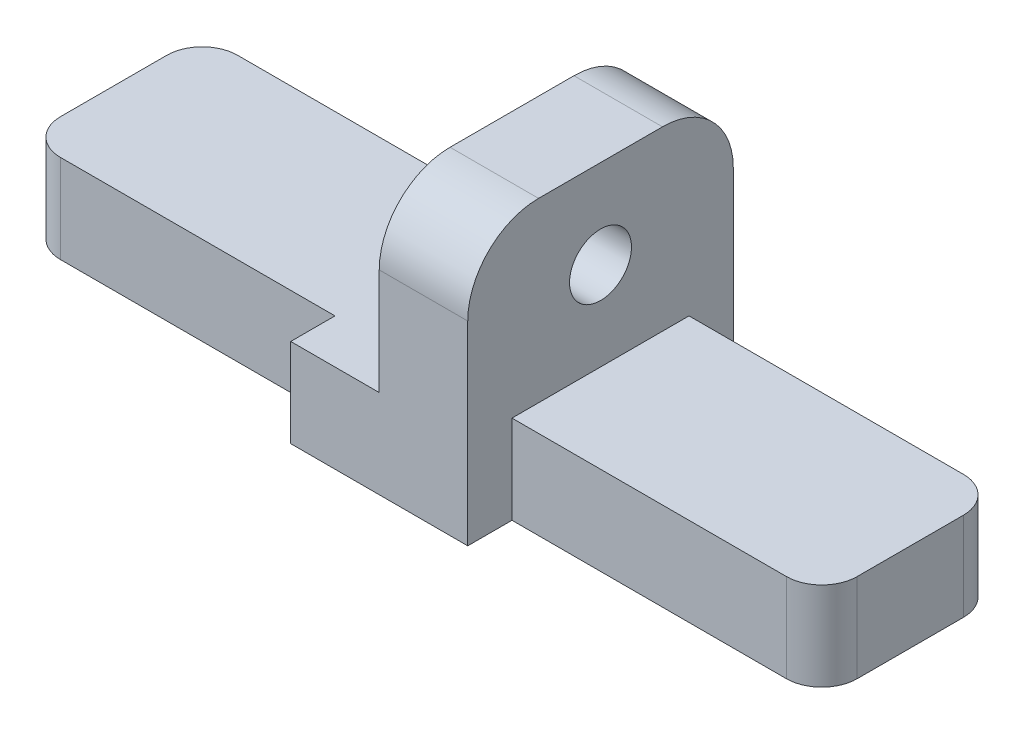
ISO-10303-21;
HEADER;
FILE_DESCRIPTION(('STEP AP214'),'2;1');
FILE_NAME('part.step','',(''),(''),'','','');
FILE_SCHEMA(('AUTOMOTIVE_DESIGN { 1 0 10303 214 1 1 1 1 }'));
ENDSEC;
DATA;
#1=APPLICATION_CONTEXT('core data for automotive mechanical design processes');
#2=APPLICATION_PROTOCOL_DEFINITION('international standard','automotive_design',2000,#1);
#3=PRODUCT_CONTEXT('',#1,'mechanical');
#4=PRODUCT('Part','Part','',(#3));
#5=PRODUCT_RELATED_PRODUCT_CATEGORY('part','',(#4));
#6=PRODUCT_DEFINITION_FORMATION('','',#4);
#7=PRODUCT_DEFINITION_CONTEXT('part definition',#1,'design');
#8=PRODUCT_DEFINITION('design','',#6,#7);
#9=PRODUCT_DEFINITION_SHAPE('','',#8);
#10=(LENGTH_UNIT() NAMED_UNIT(*) SI_UNIT(.MILLI.,.METRE.));
#11=(NAMED_UNIT(*) PLANE_ANGLE_UNIT() SI_UNIT($,.RADIAN.));
#12=(NAMED_UNIT(*) SI_UNIT($,.STERADIAN.) SOLID_ANGLE_UNIT());
#13=UNCERTAINTY_MEASURE_WITH_UNIT(LENGTH_MEASURE(1.E-05),#10,'distance_accuracy_value','');
#14=(GEOMETRIC_REPRESENTATION_CONTEXT(3) GLOBAL_UNCERTAINTY_ASSIGNED_CONTEXT((#13)) GLOBAL_UNIT_ASSIGNED_CONTEXT((#10,
#11,#12)) REPRESENTATION_CONTEXT('',''));
#15=CARTESIAN_POINT('',(0.,0.,0.));
#16=DIRECTION('',(0.,0.,1.));
#17=DIRECTION('',(1.,0.,0.));
#18=AXIS2_PLACEMENT_3D('',#15,#16,#17);
#19=CARTESIAN_POINT('',(-5.,-18.0277563773199,-7.5));
#20=DIRECTION('',(-1.,0.,0.));
#21=DIRECTION('',(0.,0.,1.));
#22=AXIS2_PLACEMENT_3D('',#19,#20,#21);
#23=PLANE('',#22);
#24=DIRECTION('',(0.,0.,1.));
#25=VECTOR('',#24,1.);
#26=CARTESIAN_POINT('',(-5.,5.,-10.));
#27=LINE('',#26,#25);
#28=CARTESIAN_POINT('',(-5.,5.,-7.5));
#29=VERTEX_POINT('',#28);
#30=CARTESIAN_POINT('',(-5.,5.,-5.));
#31=VERTEX_POINT('',#30);
#32=EDGE_CURVE('E192',#29,#31,#27,.T.);
#33=ORIENTED_EDGE('',*,*,#32,.F.);
#34=DIRECTION('',(0.,1.,0.));
#35=VECTOR('',#34,1.);
#36=CARTESIAN_POINT('',(-5.,-18.0277563773199,-7.5));
#37=LINE('',#36,#35);
#38=CARTESIAN_POINT('',(-5.,0.,-7.5));
#39=VERTEX_POINT('',#38);
#40=EDGE_CURVE('E203',#39,#29,#37,.T.);
#41=ORIENTED_EDGE('',*,*,#40,.F.);
#42=DIRECTION('',(0.,0.,-1.));
#43=VECTOR('',#42,1.);
#44=CARTESIAN_POINT('',(-5.,0.,-7.5));
#45=LINE('',#44,#43);
#46=CARTESIAN_POINT('',(-5.00000000000001,0.,-5.));
#47=VERTEX_POINT('',#46);
#48=EDGE_CURVE('E374',#47,#39,#45,.T.);
#49=ORIENTED_EDGE('',*,*,#48,.F.);
#50=DIRECTION('',(0.,-1.,0.));
#51=VECTOR('',#50,1.);
#52=CARTESIAN_POINT('',(-5.,5.,-5.));
#53=LINE('',#52,#51);
#54=EDGE_CURVE('E205',#31,#47,#53,.T.);
#55=ORIENTED_EDGE('',*,*,#54,.F.);
#56=EDGE_LOOP('',(#33,#41,#49,#55));
#57=FACE_BOUND('',#56,.T.);
#58=ADVANCED_FACE('F49',(#57),#23,.T.);
#59=CARTESIAN_POINT('',(0.,15.,0.));
#60=DIRECTION('',(0.,1.,0.));
#61=DIRECTION('',(0.,0.,1.));
#62=AXIS2_PLACEMENT_3D('',#59,#60,#61);
#63=PLANE('',#62);
#64=DIRECTION('',(-1.,0.,0.));
#65=VECTOR('',#64,1.);
#66=CARTESIAN_POINT('',(0.,15.,-3.5));
#67=LINE('',#66,#65);
#68=CARTESIAN_POINT('',(5.,15.,-3.5));
#69=VERTEX_POINT('',#68);
#70=CARTESIAN_POINT('',(0.,15.,-3.5));
#71=VERTEX_POINT('',#70);
#72=EDGE_CURVE('E331',#69,#71,#67,.T.);
#73=ORIENTED_EDGE('',*,*,#72,.T.);
#74=DIRECTION('',(0.,0.,-1.));
#75=VECTOR('',#74,1.);
#76=CARTESIAN_POINT('',(0.,15.,-10.));
#77=LINE('',#76,#75);
#78=CARTESIAN_POINT('',(0.,15.,3.5));
#79=VERTEX_POINT('',#78);
#80=EDGE_CURVE('E65',#79,#71,#77,.T.);
#81=ORIENTED_EDGE('',*,*,#80,.F.);
#82=DIRECTION('',(1.,0.,0.));
#83=VECTOR('',#82,1.);
#84=CARTESIAN_POINT('',(0.,15.,3.5));
#85=LINE('',#84,#83);
#86=CARTESIAN_POINT('',(5.,15.,3.5));
#87=VERTEX_POINT('',#86);
#88=EDGE_CURVE('E335',#79,#87,#85,.T.);
#89=ORIENTED_EDGE('',*,*,#88,.T.);
#90=DIRECTION('',(0.,0.,-1.));
#91=VECTOR('',#90,1.);
#92=CARTESIAN_POINT('',(5.,15.,-7.5));
#93=LINE('',#92,#91);
#94=EDGE_CURVE('E225',#87,#69,#93,.T.);
#95=ORIENTED_EDGE('',*,*,#94,.T.);
#96=EDGE_LOOP('',(#73,#81,#89,#95));
#97=FACE_BOUND('',#96,.T.);
#98=ADVANCED_FACE('F357',(#97),#63,.T.);
#99=CARTESIAN_POINT('',(5.,10.,0.));
#100=DIRECTION('',(-1.,0.,0.));
#101=DIRECTION('',(0.,0.,1.));
#102=AXIS2_PLACEMENT_3D('',#99,#100,#101);
#103=CYLINDRICAL_SURFACE('',#102,1.75);
#104=CARTESIAN_POINT('',(5.,10.,0.));
#105=DIRECTION('',(-1.,0.,0.));
#106=DIRECTION('',(0.,0.,1.));
#107=AXIS2_PLACEMENT_3D('',#104,#105,#106);
#108=CIRCLE('',#107,1.75);
#109=CARTESIAN_POINT('',(5.,10.,1.75));
#110=VERTEX_POINT('',#109);
#111=EDGE_CURVE('E360',#110,#110,#108,.T.);
#112=ORIENTED_EDGE('',*,*,#111,.F.);
#113=EDGE_LOOP('',(#112));
#114=FACE_BOUND('',#113,.T.);
#115=CARTESIAN_POINT('',(0.,10.,0.));
#116=DIRECTION('',(-1.,0.,0.));
#117=DIRECTION('',(0.,0.,1.));
#118=AXIS2_PLACEMENT_3D('',#115,#116,#117);
#119=CIRCLE('',#118,1.75);
#120=CARTESIAN_POINT('',(0.,10.,1.75));
#121=VERTEX_POINT('',#120);
#122=EDGE_CURVE('E424',#121,#121,#119,.F.);
#123=ORIENTED_EDGE('',*,*,#122,.F.);
#124=EDGE_LOOP('',(#123));
#125=FACE_BOUND('',#124,.T.);
#126=ADVANCED_FACE('F544',(#114,#125),#103,.F.);
#127=CARTESIAN_POINT('',(0.,11.,3.5));
#128=DIRECTION('',(1.,0.,0.));
#129=DIRECTION('',(0.,0.,-1.));
#130=AXIS2_PLACEMENT_3D('',#127,#128,#129);
#131=CYLINDRICAL_SURFACE('',#130,4.);
#132=ORIENTED_EDGE('',*,*,#88,.F.);
#133=CARTESIAN_POINT('',(0.,11.,3.5));
#134=DIRECTION('',(-1.,0.,0.));
#135=DIRECTION('',(0.,0.,1.));
#136=AXIS2_PLACEMENT_3D('',#133,#134,#135);
#137=CIRCLE('',#136,4.);
#138=CARTESIAN_POINT('',(0.,11.,7.5));
#139=VERTEX_POINT('',#138);
#140=EDGE_CURVE('E431',#79,#139,#137,.F.);
#141=ORIENTED_EDGE('',*,*,#140,.T.);
#142=DIRECTION('',(1.,0.,0.));
#143=VECTOR('',#142,1.);
#144=CARTESIAN_POINT('',(-5.,11.,7.5));
#145=LINE('',#144,#143);
#146=CARTESIAN_POINT('',(5.,11.,7.5));
#147=VERTEX_POINT('',#146);
#148=EDGE_CURVE('E343',#147,#139,#145,.F.);
#149=ORIENTED_EDGE('',*,*,#148,.F.);
#150=CARTESIAN_POINT('',(5.,11.,3.5));
#151=DIRECTION('',(1.,0.,0.));
#152=DIRECTION('',(0.,0.,-1.));
#153=AXIS2_PLACEMENT_3D('',#150,#151,#152);
#154=CIRCLE('',#153,4.);
#155=EDGE_CURVE('E73',#87,#147,#154,.T.);
#156=ORIENTED_EDGE('',*,*,#155,.F.);
#157=EDGE_LOOP('',(#132,#141,#149,#156));
#158=FACE_BOUND('',#157,.T.);
#159=ADVANCED_FACE('F647',(#158),#131,.T.);
#160=CARTESIAN_POINT('',(0.,11.,-3.5));
#161=DIRECTION('',(-1.,0.,0.));
#162=DIRECTION('',(0.,0.,1.));
#163=AXIS2_PLACEMENT_3D('',#160,#161,#162);
#164=CYLINDRICAL_SURFACE('',#163,4.);
#165=DIRECTION('',(-1.,0.,0.));
#166=VECTOR('',#165,1.);
#167=CARTESIAN_POINT('',(-5.,11.,-7.5));
#168=LINE('',#167,#166);
#169=CARTESIAN_POINT('',(0.,11.,-7.5));
#170=VERTEX_POINT('',#169);
#171=CARTESIAN_POINT('',(5.,11.,-7.5));
#172=VERTEX_POINT('',#171);
#173=EDGE_CURVE('E347',#170,#172,#168,.F.);
#174=ORIENTED_EDGE('',*,*,#173,.F.);
#175=CARTESIAN_POINT('',(0.,11.,-3.5));
#176=DIRECTION('',(-1.,0.,0.));
#177=DIRECTION('',(0.,0.,1.));
#178=AXIS2_PLACEMENT_3D('',#175,#176,#177);
#179=CIRCLE('',#178,4.);
#180=EDGE_CURVE('E58',#170,#71,#179,.F.);
#181=ORIENTED_EDGE('',*,*,#180,.T.);
#182=ORIENTED_EDGE('',*,*,#72,.F.);
#183=CARTESIAN_POINT('',(5.,11.,-3.5));
#184=DIRECTION('',(1.,0.,0.));
#185=DIRECTION('',(0.,0.,-1.));
#186=AXIS2_PLACEMENT_3D('',#183,#184,#185);
#187=CIRCLE('',#186,4.);
#188=EDGE_CURVE('E338',#172,#69,#187,.T.);
#189=ORIENTED_EDGE('',*,*,#188,.F.);
#190=EDGE_LOOP('',(#174,#181,#182,#189));
#191=FACE_BOUND('',#190,.T.);
#192=ADVANCED_FACE('F51',(#191),#164,.T.);
#193=CARTESIAN_POINT('',(-22.5,5.,-5.));
#194=DIRECTION('',(0.,0.,1.));
#195=DIRECTION('',(1.,0.,0.));
#196=AXIS2_PLACEMENT_3D('',#193,#194,#195);
#197=PLANE('',#196);
#198=DIRECTION('',(-1.,0.,0.));
#199=VECTOR('',#198,1.);
#200=CARTESIAN_POINT('',(-22.5,5.,-5.));
#201=LINE('',#200,#199);
#202=CARTESIAN_POINT('',(20.5,5.,-5.));
#203=VERTEX_POINT('',#202);
#204=CARTESIAN_POINT('',(4.99999999999999,5.,-5.));
#205=VERTEX_POINT('',#204);
#206=EDGE_CURVE('E255',#203,#205,#201,.T.);
#207=ORIENTED_EDGE('',*,*,#206,.F.);
#208=DIRECTION('',(0.,-1.,0.));
#209=VECTOR('',#208,1.);
#210=CARTESIAN_POINT('',(20.5,5.,-5.));
#211=LINE('',#210,#209);
#212=CARTESIAN_POINT('',(20.5,0.,-5.));
#213=VERTEX_POINT('',#212);
#214=EDGE_CURVE('E311',#203,#213,#211,.T.);
#215=ORIENTED_EDGE('',*,*,#214,.T.);
#216=DIRECTION('',(-1.,0.,0.));
#217=VECTOR('',#216,1.);
#218=CARTESIAN_POINT('',(-22.5,0.,-5.));
#219=LINE('',#218,#217);
#220=CARTESIAN_POINT('',(4.99999999999999,0.,-5.));
#221=VERTEX_POINT('',#220);
#222=EDGE_CURVE('E270',#213,#221,#219,.T.);
#223=ORIENTED_EDGE('',*,*,#222,.T.);
#224=DIRECTION('',(0.,1.,0.));
#225=VECTOR('',#224,1.);
#226=CARTESIAN_POINT('',(5.,5.,-5.));
#227=LINE('',#226,#225);
#228=EDGE_CURVE('E244',#221,#205,#227,.T.);
#229=ORIENTED_EDGE('',*,*,#228,.T.);
#230=EDGE_LOOP('',(#207,#215,#223,#229));
#231=FACE_BOUND('',#230,.T.);
#232=ADVANCED_FACE('F505',(#231),#197,.F.);
#233=CARTESIAN_POINT('',(-22.5,5.,5.));
#234=DIRECTION('',(0.,0.,-1.));
#235=DIRECTION('',(-1.,0.,0.));
#236=AXIS2_PLACEMENT_3D('',#233,#234,#235);
#237=PLANE('',#236);
#238=DIRECTION('',(1.,0.,0.));
#239=VECTOR('',#238,1.);
#240=CARTESIAN_POINT('',(-22.5,0.,5.));
#241=LINE('',#240,#239);
#242=CARTESIAN_POINT('',(4.99999999999999,0.,5.));
#243=VERTEX_POINT('',#242);
#244=CARTESIAN_POINT('',(20.5,0.,5.));
#245=VERTEX_POINT('',#244);
#246=EDGE_CURVE('E277',#243,#245,#241,.T.);
#247=ORIENTED_EDGE('',*,*,#246,.T.);
#248=DIRECTION('',(0.,-1.,0.));
#249=VECTOR('',#248,1.);
#250=CARTESIAN_POINT('',(20.5,5.,5.));
#251=LINE('',#250,#249);
#252=CARTESIAN_POINT('',(20.5,5.,5.));
#253=VERTEX_POINT('',#252);
#254=EDGE_CURVE('E328',#245,#253,#251,.F.);
#255=ORIENTED_EDGE('',*,*,#254,.T.);
#256=DIRECTION('',(1.,0.,0.));
#257=VECTOR('',#256,1.);
#258=CARTESIAN_POINT('',(-22.5,5.,5.));
#259=LINE('',#258,#257);
#260=CARTESIAN_POINT('',(4.99999999999999,5.,5.));
#261=VERTEX_POINT('',#260);
#262=EDGE_CURVE('E261',#261,#253,#259,.T.);
#263=ORIENTED_EDGE('',*,*,#262,.F.);
#264=DIRECTION('',(0.,-1.,0.));
#265=VECTOR('',#264,1.);
#266=CARTESIAN_POINT('',(5.,5.,5.));
#267=LINE('',#266,#265);
#268=EDGE_CURVE('E241',#261,#243,#267,.T.);
#269=ORIENTED_EDGE('',*,*,#268,.T.);
#270=EDGE_LOOP('',(#247,#255,#263,#269));
#271=FACE_BOUND('',#270,.T.);
#272=ADVANCED_FACE('F483',(#271),#237,.F.);
#273=CARTESIAN_POINT('',(0.,5.,0.));
#274=DIRECTION('',(0.,1.,0.));
#275=DIRECTION('',(0.,0.,1.));
#276=AXIS2_PLACEMENT_3D('',#273,#274,#275);
#277=PLANE('',#276);
#278=DIRECTION('',(0.,0.,-1.));
#279=VECTOR('',#278,1.);
#280=CARTESIAN_POINT('',(22.5,5.,-5.));
#281=LINE('',#280,#279);
#282=CARTESIAN_POINT('',(22.5,5.,3.));
#283=VERTEX_POINT('',#282);
#284=CARTESIAN_POINT('',(22.5,5.,-3.));
#285=VERTEX_POINT('',#284);
#286=EDGE_CURVE('E249',#283,#285,#281,.T.);
#287=ORIENTED_EDGE('',*,*,#286,.T.);
#288=CARTESIAN_POINT('',(20.5,5.,-3.));
#289=DIRECTION('',(0.,1.,0.));
#290=DIRECTION('',(0.,0.,1.));
#291=AXIS2_PLACEMENT_3D('',#288,#289,#290);
#292=CIRCLE('',#291,2.);
#293=EDGE_CURVE('E325',#285,#203,#292,.T.);
#294=ORIENTED_EDGE('',*,*,#293,.T.);
#295=ORIENTED_EDGE('',*,*,#206,.T.);
#296=DIRECTION('',(0.,0.,-1.));
#297=VECTOR('',#296,1.);
#298=CARTESIAN_POINT('',(5.,5.,0.));
#299=LINE('',#298,#297);
#300=EDGE_CURVE('E237',#261,#205,#299,.T.);
#301=ORIENTED_EDGE('',*,*,#300,.F.);
#302=ORIENTED_EDGE('',*,*,#262,.T.);
#303=CARTESIAN_POINT('',(20.5,5.,3.));
#304=DIRECTION('',(0.,1.,0.));
#305=DIRECTION('',(0.,0.,1.));
#306=AXIS2_PLACEMENT_3D('',#303,#304,#305);
#307=CIRCLE('',#306,2.);
#308=EDGE_CURVE('E322',#253,#283,#307,.T.);
#309=ORIENTED_EDGE('',*,*,#308,.T.);
#310=EDGE_LOOP('',(#287,#294,#295,#301,#302,#309));
#311=FACE_BOUND('',#310,.T.);
#312=ADVANCED_FACE('F494',(#311),#277,.T.);
#313=CARTESIAN_POINT('',(22.5,5.,-5.));
#314=DIRECTION('',(-1.,0.,0.));
#315=DIRECTION('',(0.,0.,1.));
#316=AXIS2_PLACEMENT_3D('',#313,#314,#315);
#317=PLANE('',#316);
#318=DIRECTION('',(0.,0.,-1.));
#319=VECTOR('',#318,1.);
#320=CARTESIAN_POINT('',(22.5,0.,-5.));
#321=LINE('',#320,#319);
#322=CARTESIAN_POINT('',(22.5,0.,3.));
#323=VERTEX_POINT('',#322);
#324=CARTESIAN_POINT('',(22.5,0.,-3.));
#325=VERTEX_POINT('',#324);
#326=EDGE_CURVE('E248',#323,#325,#321,.T.);
#327=ORIENTED_EDGE('',*,*,#326,.T.);
#328=DIRECTION('',(0.,-1.,0.));
#329=VECTOR('',#328,1.);
#330=CARTESIAN_POINT('',(22.5,5.,-3.));
#331=LINE('',#330,#329);
#332=EDGE_CURVE('E319',#325,#285,#331,.F.);
#333=ORIENTED_EDGE('',*,*,#332,.T.);
#334=ORIENTED_EDGE('',*,*,#286,.F.);
#335=DIRECTION('',(0.,-1.,0.));
#336=VECTOR('',#335,1.);
#337=CARTESIAN_POINT('',(22.5,5.,3.));
#338=LINE('',#337,#336);
#339=EDGE_CURVE('E315',#283,#323,#338,.T.);
#340=ORIENTED_EDGE('',*,*,#339,.T.);
#341=EDGE_LOOP('',(#327,#333,#334,#340));
#342=FACE_BOUND('',#341,.T.);
#343=ADVANCED_FACE('F497',(#342),#317,.F.);
#344=CARTESIAN_POINT('',(-20.5,0.,-5.));
#345=VERTEX_POINT('',#344);
#346=EDGE_CURVE('E269',#47,#345,#219,.T.);
#347=ORIENTED_EDGE('',*,*,#346,.T.);
#348=DIRECTION('',(0.,-1.,0.));
#349=VECTOR('',#348,1.);
#350=CARTESIAN_POINT('',(-20.5,5.,-5.));
#351=LINE('',#350,#349);
#352=CARTESIAN_POINT('',(-20.5,5.,-5.));
#353=VERTEX_POINT('',#352);
#354=EDGE_CURVE('E308',#345,#353,#351,.F.);
#355=ORIENTED_EDGE('',*,*,#354,.T.);
#356=EDGE_CURVE('E253',#31,#353,#201,.T.);
#357=ORIENTED_EDGE('',*,*,#356,.F.);
#358=ORIENTED_EDGE('',*,*,#54,.T.);
#359=EDGE_LOOP('',(#347,#355,#357,#358));
#360=FACE_BOUND('',#359,.T.);
#361=ADVANCED_FACE('F531',(#360),#197,.F.);
#362=CARTESIAN_POINT('',(-22.5,5.,-5.));
#363=DIRECTION('',(1.,0.,0.));
#364=DIRECTION('',(0.,0.,-1.));
#365=AXIS2_PLACEMENT_3D('',#362,#363,#364);
#366=PLANE('',#365);
#367=DIRECTION('',(0.,0.,1.));
#368=VECTOR('',#367,1.);
#369=CARTESIAN_POINT('',(-22.5,0.,-5.));
#370=LINE('',#369,#368);
#371=CARTESIAN_POINT('',(-22.5,0.,-3.));
#372=VERTEX_POINT('',#371);
#373=CARTESIAN_POINT('',(-22.5,0.,3.));
#374=VERTEX_POINT('',#373);
#375=EDGE_CURVE('E273',#372,#374,#370,.T.);
#376=ORIENTED_EDGE('',*,*,#375,.T.);
#377=DIRECTION('',(0.,-1.,0.));
#378=VECTOR('',#377,1.);
#379=CARTESIAN_POINT('',(-22.5,5.,3.));
#380=LINE('',#379,#378);
#381=CARTESIAN_POINT('',(-22.5,5.,3.));
#382=VERTEX_POINT('',#381);
#383=EDGE_CURVE('E299',#374,#382,#380,.F.);
#384=ORIENTED_EDGE('',*,*,#383,.T.);
#385=DIRECTION('',(0.,0.,1.));
#386=VECTOR('',#385,1.);
#387=CARTESIAN_POINT('',(-22.5,5.,-5.));
#388=LINE('',#387,#386);
#389=CARTESIAN_POINT('',(-22.5,5.,-3.));
#390=VERTEX_POINT('',#389);
#391=EDGE_CURVE('E258',#390,#382,#388,.T.);
#392=ORIENTED_EDGE('',*,*,#391,.F.);
#393=DIRECTION('',(0.,-1.,0.));
#394=VECTOR('',#393,1.);
#395=CARTESIAN_POINT('',(-22.5,5.,-3.));
#396=LINE('',#395,#394);
#397=EDGE_CURVE('E295',#390,#372,#396,.T.);
#398=ORIENTED_EDGE('',*,*,#397,.T.);
#399=EDGE_LOOP('',(#376,#384,#392,#398));
#400=FACE_BOUND('',#399,.T.);
#401=ADVANCED_FACE('F526',(#400),#366,.F.);
#402=CARTESIAN_POINT('',(-20.5,5.,5.));
#403=VERTEX_POINT('',#402);
#404=CARTESIAN_POINT('',(-5.,5.,5.));
#405=VERTEX_POINT('',#404);
#406=EDGE_CURVE('E262',#403,#405,#259,.T.);
#407=ORIENTED_EDGE('',*,*,#406,.F.);
#408=DIRECTION('',(0.,-1.,0.));
#409=VECTOR('',#408,1.);
#410=CARTESIAN_POINT('',(-20.5,5.,5.));
#411=LINE('',#410,#409);
#412=CARTESIAN_POINT('',(-20.5,0.,5.));
#413=VERTEX_POINT('',#412);
#414=EDGE_CURVE('E266',#403,#413,#411,.T.);
#415=ORIENTED_EDGE('',*,*,#414,.T.);
#416=CARTESIAN_POINT('',(-5.00000000000001,0.,5.));
#417=VERTEX_POINT('',#416);
#418=EDGE_CURVE('E254',#413,#417,#241,.T.);
#419=ORIENTED_EDGE('',*,*,#418,.T.);
#420=DIRECTION('',(0.,1.,0.));
#421=VECTOR('',#420,1.);
#422=CARTESIAN_POINT('',(-5.,5.,5.));
#423=LINE('',#422,#421);
#424=EDGE_CURVE('E231',#417,#405,#423,.T.);
#425=ORIENTED_EDGE('',*,*,#424,.T.);
#426=EDGE_LOOP('',(#407,#415,#419,#425));
#427=FACE_BOUND('',#426,.T.);
#428=ADVANCED_FACE('F518',(#427),#237,.F.);
#429=ORIENTED_EDGE('',*,*,#391,.T.);
#430=CARTESIAN_POINT('',(-20.5,5.,3.));
#431=DIRECTION('',(0.,1.,0.));
#432=DIRECTION('',(0.,0.,1.));
#433=AXIS2_PLACEMENT_3D('',#430,#431,#432);
#434=CIRCLE('',#433,2.);
#435=EDGE_CURVE('E305',#382,#403,#434,.T.);
#436=ORIENTED_EDGE('',*,*,#435,.T.);
#437=ORIENTED_EDGE('',*,*,#406,.T.);
#438=CARTESIAN_POINT('',(-5.,5.,7.5));
#439=VERTEX_POINT('',#438);
#440=EDGE_CURVE('E207',#405,#439,#27,.T.);
#441=ORIENTED_EDGE('',*,*,#440,.T.);
#442=DIRECTION('',(1.,0.,0.));
#443=VECTOR('',#442,1.);
#444=CARTESIAN_POINT('',(-5.,5.,7.5));
#445=LINE('',#444,#443);
#446=CARTESIAN_POINT('',(0.,5.,7.5));
#447=VERTEX_POINT('',#446);
#448=EDGE_CURVE('E365',#439,#447,#445,.T.);
#449=ORIENTED_EDGE('',*,*,#448,.T.);
#450=DIRECTION('',(0.,0.,1.));
#451=VECTOR('',#450,1.);
#452=CARTESIAN_POINT('',(0.,5.,-10.));
#453=LINE('',#452,#451);
#454=CARTESIAN_POINT('',(0.,5.,-7.5));
#455=VERTEX_POINT('',#454);
#456=EDGE_CURVE('E195',#455,#447,#453,.T.);
#457=ORIENTED_EDGE('',*,*,#456,.F.);
#458=DIRECTION('',(-1.,0.,0.));
#459=VECTOR('',#458,1.);
#460=CARTESIAN_POINT('',(-5.,5.,-7.5));
#461=LINE('',#460,#459);
#462=EDGE_CURVE('E11',#455,#29,#461,.T.);
#463=ORIENTED_EDGE('',*,*,#462,.T.);
#464=ORIENTED_EDGE('',*,*,#32,.T.);
#465=ORIENTED_EDGE('',*,*,#356,.T.);
#466=CARTESIAN_POINT('',(-20.5,5.,-3.));
#467=DIRECTION('',(0.,1.,0.));
#468=DIRECTION('',(0.,0.,1.));
#469=AXIS2_PLACEMENT_3D('',#466,#467,#468);
#470=CIRCLE('',#469,2.);
#471=EDGE_CURVE('E302',#353,#390,#470,.T.);
#472=ORIENTED_EDGE('',*,*,#471,.T.);
#473=EDGE_LOOP('',(#429,#436,#437,#441,#449,#457,#463,#464,#465,#472));
#474=FACE_BOUND('',#473,.T.);
#475=ADVANCED_FACE('F190',(#474),#277,.T.);
#476=CARTESIAN_POINT('',(0.,0.,0.));
#477=DIRECTION('',(0.,1.,0.));
#478=DIRECTION('',(0.,0.,1.));
#479=AXIS2_PLACEMENT_3D('',#476,#477,#478);
#480=PLANE('',#479);
#481=ORIENTED_EDGE('',*,*,#418,.F.);
#482=CARTESIAN_POINT('',(-20.5,0.,3.));
#483=DIRECTION('',(0.,1.,0.));
#484=DIRECTION('',(0.,0.,1.));
#485=AXIS2_PLACEMENT_3D('',#482,#483,#484);
#486=CIRCLE('',#485,2.);
#487=EDGE_CURVE('E292',#413,#374,#486,.F.);
#488=ORIENTED_EDGE('',*,*,#487,.T.);
#489=ORIENTED_EDGE('',*,*,#375,.F.);
#490=CARTESIAN_POINT('',(-20.5,0.,-3.));
#491=DIRECTION('',(0.,1.,0.));
#492=DIRECTION('',(0.,0.,1.));
#493=AXIS2_PLACEMENT_3D('',#490,#491,#492);
#494=CIRCLE('',#493,2.);
#495=EDGE_CURVE('E289',#372,#345,#494,.F.);
#496=ORIENTED_EDGE('',*,*,#495,.T.);
#497=ORIENTED_EDGE('',*,*,#346,.F.);
#498=ORIENTED_EDGE('',*,*,#48,.T.);
#499=DIRECTION('',(1.,0.,0.));
#500=VECTOR('',#499,1.);
#501=CARTESIAN_POINT('',(-5.,0.,-7.5));
#502=LINE('',#501,#500);
#503=CARTESIAN_POINT('',(5.,0.,-7.5));
#504=VERTEX_POINT('',#503);
#505=EDGE_CURVE('E211',#39,#504,#502,.T.);
#506=ORIENTED_EDGE('',*,*,#505,.T.);
#507=DIRECTION('',(0.,0.,1.));
#508=VECTOR('',#507,1.);
#509=CARTESIAN_POINT('',(5.,0.,-7.5));
#510=LINE('',#509,#508);
#511=EDGE_CURVE('E232',#504,#221,#510,.T.);
#512=ORIENTED_EDGE('',*,*,#511,.T.);
#513=ORIENTED_EDGE('',*,*,#222,.F.);
#514=CARTESIAN_POINT('',(20.5,0.,-3.));
#515=DIRECTION('',(0.,1.,0.));
#516=DIRECTION('',(0.,0.,1.));
#517=AXIS2_PLACEMENT_3D('',#514,#515,#516);
#518=CIRCLE('',#517,2.);
#519=EDGE_CURVE('E286',#213,#325,#518,.F.);
#520=ORIENTED_EDGE('',*,*,#519,.T.);
#521=ORIENTED_EDGE('',*,*,#326,.F.);
#522=CARTESIAN_POINT('',(20.5,0.,3.));
#523=DIRECTION('',(0.,1.,0.));
#524=DIRECTION('',(0.,0.,1.));
#525=AXIS2_PLACEMENT_3D('',#522,#523,#524);
#526=CIRCLE('',#525,2.);
#527=EDGE_CURVE('E283',#323,#245,#526,.F.);
#528=ORIENTED_EDGE('',*,*,#527,.T.);
#529=ORIENTED_EDGE('',*,*,#246,.F.);
#530=CARTESIAN_POINT('',(5.,0.,7.5));
#531=VERTEX_POINT('',#530);
#532=EDGE_CURVE('E377',#243,#531,#510,.T.);
#533=ORIENTED_EDGE('',*,*,#532,.T.);
#534=DIRECTION('',(-1.,0.,0.));
#535=VECTOR('',#534,1.);
#536=CARTESIAN_POINT('',(-5.,0.,7.5));
#537=LINE('',#536,#535);
#538=CARTESIAN_POINT('',(-5.,0.,7.5));
#539=VERTEX_POINT('',#538);
#540=EDGE_CURVE('E373',#531,#539,#537,.T.);
#541=ORIENTED_EDGE('',*,*,#540,.T.);
#542=EDGE_CURVE('E369',#539,#417,#45,.T.);
#543=ORIENTED_EDGE('',*,*,#542,.T.);
#544=EDGE_LOOP('',(#481,#488,#489,#496,#497,#498,#506,#512,#513,#520,#521,#528,#529,#533,#541,#543));
#545=FACE_BOUND('',#544,.T.);
#546=ADVANCED_FACE('F392',(#545),#480,.F.);
#547=CARTESIAN_POINT('',(5.,-18.0277563773199,-7.5));
#548=DIRECTION('',(1.,0.,0.));
#549=DIRECTION('',(0.,0.,-1.));
#550=AXIS2_PLACEMENT_3D('',#547,#548,#549);
#551=PLANE('',#550);
#552=ORIENTED_EDGE('',*,*,#111,.T.);
#553=EDGE_LOOP('',(#552));
#554=FACE_BOUND('',#553,.T.);
#555=ORIENTED_EDGE('',*,*,#94,.F.);
#556=ORIENTED_EDGE('',*,*,#155,.T.);
#557=DIRECTION('',(0.,1.,0.));
#558=VECTOR('',#557,1.);
#559=CARTESIAN_POINT('',(5.,-18.0277563773199,7.5));
#560=LINE('',#559,#558);
#561=EDGE_CURVE('E221',#531,#147,#560,.T.);
#562=ORIENTED_EDGE('',*,*,#561,.F.);
#563=ORIENTED_EDGE('',*,*,#532,.F.);
#564=ORIENTED_EDGE('',*,*,#268,.F.);
#565=ORIENTED_EDGE('',*,*,#300,.T.);
#566=ORIENTED_EDGE('',*,*,#228,.F.);
#567=ORIENTED_EDGE('',*,*,#511,.F.);
#568=DIRECTION('',(0.,1.,0.));
#569=VECTOR('',#568,1.);
#570=CARTESIAN_POINT('',(5.,-18.0277563773199,-7.5));
#571=LINE('',#570,#569);
#572=EDGE_CURVE('E214',#504,#172,#571,.T.);
#573=ORIENTED_EDGE('',*,*,#572,.T.);
#574=ORIENTED_EDGE('',*,*,#188,.T.);
#575=EDGE_LOOP('',(#555,#556,#562,#563,#564,#565,#566,#567,#573,#574));
#576=FACE_BOUND('',#575,.T.);
#577=ADVANCED_FACE('F508',(#554,#576),#551,.T.);
#578=ORIENTED_EDGE('',*,*,#440,.F.);
#579=ORIENTED_EDGE('',*,*,#424,.F.);
#580=ORIENTED_EDGE('',*,*,#542,.F.);
#581=DIRECTION('',(0.,1.,0.));
#582=VECTOR('',#581,1.);
#583=CARTESIAN_POINT('',(-5.,-18.0277563773199,7.5));
#584=LINE('',#583,#582);
#585=EDGE_CURVE('E213',#539,#439,#584,.T.);
#586=ORIENTED_EDGE('',*,*,#585,.T.);
#587=EDGE_LOOP('',(#578,#579,#580,#586));
#588=FACE_BOUND('',#587,.T.);
#589=ADVANCED_FACE('F514',(#588),#23,.T.);
#590=CARTESIAN_POINT('',(-5.,-18.0277563773199,7.5));
#591=DIRECTION('',(0.,0.,1.));
#592=DIRECTION('',(1.,0.,0.));
#593=AXIS2_PLACEMENT_3D('',#590,#591,#592);
#594=PLANE('',#593);
#595=ORIENTED_EDGE('',*,*,#448,.F.);
#596=ORIENTED_EDGE('',*,*,#585,.F.);
#597=ORIENTED_EDGE('',*,*,#540,.F.);
#598=ORIENTED_EDGE('',*,*,#561,.T.);
#599=ORIENTED_EDGE('',*,*,#148,.T.);
#600=DIRECTION('',(0.,-1.,0.));
#601=VECTOR('',#600,1.);
#602=CARTESIAN_POINT('',(0.,-18.0277563773199,7.5));
#603=LINE('',#602,#601);
#604=EDGE_CURVE('E427',#139,#447,#603,.T.);
#605=ORIENTED_EDGE('',*,*,#604,.T.);
#606=EDGE_LOOP('',(#595,#596,#597,#598,#599,#605));
#607=FACE_BOUND('',#606,.T.);
#608=ADVANCED_FACE('F512',(#607),#594,.T.);
#609=CARTESIAN_POINT('',(-5.,-18.0277563773199,-7.5));
#610=DIRECTION('',(0.,0.,-1.));
#611=DIRECTION('',(-1.,0.,0.));
#612=AXIS2_PLACEMENT_3D('',#609,#610,#611);
#613=PLANE('',#612);
#614=ORIENTED_EDGE('',*,*,#462,.F.);
#615=DIRECTION('',(0.,1.,0.));
#616=VECTOR('',#615,1.);
#617=CARTESIAN_POINT('',(0.,-18.0277563773199,-7.5));
#618=LINE('',#617,#616);
#619=EDGE_CURVE('E436',#455,#170,#618,.T.);
#620=ORIENTED_EDGE('',*,*,#619,.T.);
#621=ORIENTED_EDGE('',*,*,#173,.T.);
#622=ORIENTED_EDGE('',*,*,#572,.F.);
#623=ORIENTED_EDGE('',*,*,#505,.F.);
#624=ORIENTED_EDGE('',*,*,#40,.T.);
#625=EDGE_LOOP('',(#614,#620,#621,#622,#623,#624));
#626=FACE_BOUND('',#625,.T.);
#627=ADVANCED_FACE('F209',(#626),#613,.T.);
#628=CARTESIAN_POINT('',(-20.5,5.,3.));
#629=DIRECTION('',(0.,-1.,0.));
#630=DIRECTION('',(0.,0.,-1.));
#631=AXIS2_PLACEMENT_3D('',#628,#629,#630);
#632=CYLINDRICAL_SURFACE('',#631,2.);
#633=ORIENTED_EDGE('',*,*,#435,.F.);
#634=ORIENTED_EDGE('',*,*,#383,.F.);
#635=ORIENTED_EDGE('',*,*,#487,.F.);
#636=ORIENTED_EDGE('',*,*,#414,.F.);
#637=EDGE_LOOP('',(#633,#634,#635,#636));
#638=FACE_BOUND('',#637,.T.);
#639=ADVANCED_FACE('F522',(#638),#632,.T.);
#640=CARTESIAN_POINT('',(-20.5,5.,-3.));
#641=DIRECTION('',(0.,-1.,0.));
#642=DIRECTION('',(0.,0.,-1.));
#643=AXIS2_PLACEMENT_3D('',#640,#641,#642);
#644=CYLINDRICAL_SURFACE('',#643,2.);
#645=ORIENTED_EDGE('',*,*,#471,.F.);
#646=ORIENTED_EDGE('',*,*,#354,.F.);
#647=ORIENTED_EDGE('',*,*,#495,.F.);
#648=ORIENTED_EDGE('',*,*,#397,.F.);
#649=EDGE_LOOP('',(#645,#646,#647,#648));
#650=FACE_BOUND('',#649,.T.);
#651=ADVANCED_FACE('F530',(#650),#644,.T.);
#652=CARTESIAN_POINT('',(20.5,5.,-3.));
#653=DIRECTION('',(0.,-1.,0.));
#654=DIRECTION('',(0.,0.,-1.));
#655=AXIS2_PLACEMENT_3D('',#652,#653,#654);
#656=CYLINDRICAL_SURFACE('',#655,2.);
#657=ORIENTED_EDGE('',*,*,#293,.F.);
#658=ORIENTED_EDGE('',*,*,#332,.F.);
#659=ORIENTED_EDGE('',*,*,#519,.F.);
#660=ORIENTED_EDGE('',*,*,#214,.F.);
#661=EDGE_LOOP('',(#657,#658,#659,#660));
#662=FACE_BOUND('',#661,.T.);
#663=ADVANCED_FACE('F501',(#662),#656,.T.);
#664=CARTESIAN_POINT('',(20.5,5.,3.));
#665=DIRECTION('',(0.,-1.,0.));
#666=DIRECTION('',(0.,0.,-1.));
#667=AXIS2_PLACEMENT_3D('',#664,#665,#666);
#668=CYLINDRICAL_SURFACE('',#667,2.);
#669=ORIENTED_EDGE('',*,*,#308,.F.);
#670=ORIENTED_EDGE('',*,*,#254,.F.);
#671=ORIENTED_EDGE('',*,*,#527,.F.);
#672=ORIENTED_EDGE('',*,*,#339,.F.);
#673=EDGE_LOOP('',(#669,#670,#671,#672));
#674=FACE_BOUND('',#673,.T.);
#675=ADVANCED_FACE('F490',(#674),#668,.T.);
#676=CARTESIAN_POINT('',(0.,0.,0.));
#677=DIRECTION('',(-1.,0.,0.));
#678=DIRECTION('',(0.,0.,1.));
#679=AXIS2_PLACEMENT_3D('',#676,#677,#678);
#680=PLANE('',#679);
#681=ORIENTED_EDGE('',*,*,#140,.F.);
#682=ORIENTED_EDGE('',*,*,#80,.T.);
#683=ORIENTED_EDGE('',*,*,#180,.F.);
#684=ORIENTED_EDGE('',*,*,#619,.F.);
#685=ORIENTED_EDGE('',*,*,#456,.T.);
#686=ORIENTED_EDGE('',*,*,#604,.F.);
#687=EDGE_LOOP('',(#681,#682,#683,#684,#685,#686));
#688=FACE_BOUND('',#687,.T.);
#689=ORIENTED_EDGE('',*,*,#122,.T.);
#690=EDGE_LOOP('',(#689));
#691=FACE_BOUND('',#690,.T.);
#692=ADVANCED_FACE('F620',(#688,#691),#680,.T.);
#693=CLOSED_SHELL('',(#58,#98,#126,#159,#192,#232,#272,#312,#343,#361,#401,#428,#475,#546,#577,
#589,#608,#627,#639,#651,#663,#675,#692));
#694=MANIFOLD_SOLID_BREP('B2',#693);
#695=ADVANCED_BREP_SHAPE_REPRESENTATION('',(#18,#694),#14);
#696=SHAPE_DEFINITION_REPRESENTATION(#9,#695);
ENDSEC;
END-ISO-10303-21;
